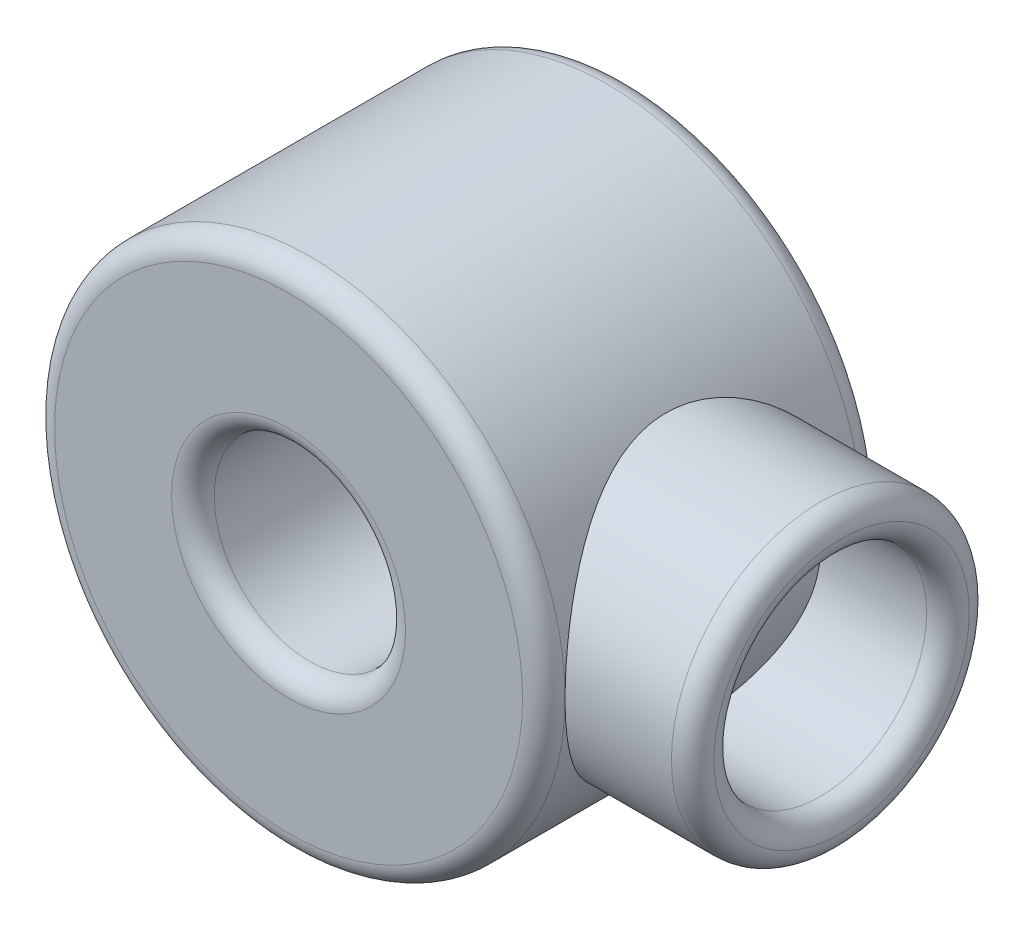
ISO-10303-21;
HEADER;
FILE_DESCRIPTION(('STEP AP214'),'2;1');
FILE_NAME('part.step','',(''),(''),'','','');
FILE_SCHEMA(('AUTOMOTIVE_DESIGN { 1 0 10303 214 1 1 1 1 }'));
ENDSEC;
DATA;
#1=APPLICATION_CONTEXT('core data for automotive mechanical design processes');
#2=APPLICATION_PROTOCOL_DEFINITION('international standard','automotive_design',2000,#1);
#3=PRODUCT_CONTEXT('',#1,'mechanical');
#4=PRODUCT('Part','Part','',(#3));
#5=PRODUCT_RELATED_PRODUCT_CATEGORY('part','',(#4));
#6=PRODUCT_DEFINITION_FORMATION('','',#4);
#7=PRODUCT_DEFINITION_CONTEXT('part definition',#1,'design');
#8=PRODUCT_DEFINITION('design','',#6,#7);
#9=PRODUCT_DEFINITION_SHAPE('','',#8);
#10=(LENGTH_UNIT() NAMED_UNIT(*) SI_UNIT(.MILLI.,.METRE.));
#11=(NAMED_UNIT(*) PLANE_ANGLE_UNIT() SI_UNIT($,.RADIAN.));
#12=(NAMED_UNIT(*) SI_UNIT($,.STERADIAN.) SOLID_ANGLE_UNIT());
#13=UNCERTAINTY_MEASURE_WITH_UNIT(LENGTH_MEASURE(1.E-05),#10,'distance_accuracy_value','');
#14=(GEOMETRIC_REPRESENTATION_CONTEXT(3) GLOBAL_UNCERTAINTY_ASSIGNED_CONTEXT((#13)) GLOBAL_UNIT_ASSIGNED_CONTEXT((#10,
#11,#12)) REPRESENTATION_CONTEXT('',''));
#15=CARTESIAN_POINT('',(0.,0.,0.));
#16=DIRECTION('',(0.,0.,1.));
#17=DIRECTION('',(1.,0.,0.));
#18=AXIS2_PLACEMENT_3D('',#15,#16,#17);
#19=CARTESIAN_POINT('',(0.,0.,25.4));
#20=DIRECTION('',(0.,0.,1.));
#21=DIRECTION('',(1.,0.,0.));
#22=AXIS2_PLACEMENT_3D('',#19,#20,#21);
#23=PLANE('',#22);
#24=CARTESIAN_POINT('',(0.,0.,25.4));
#25=DIRECTION('',(0.,0.,1.));
#26=DIRECTION('',(1.,0.,0.));
#27=AXIS2_PLACEMENT_3D('',#24,#25,#26);
#28=CIRCLE('',#27,17.4625);
#29=CARTESIAN_POINT('',(17.4625,0.,25.4));
#30=VERTEX_POINT('',#29);
#31=EDGE_CURVE('E11',#30,#30,#28,.F.);
#32=ORIENTED_EDGE('',*,*,#31,.T.);
#33=EDGE_LOOP('',(#32));
#34=FACE_BOUND('',#33,.T.);
#35=CARTESIAN_POINT('',(0.,0.,25.4));
#36=DIRECTION('',(0.,0.,1.));
#37=DIRECTION('',(1.,0.,0.));
#38=AXIS2_PLACEMENT_3D('',#35,#36,#37);
#39=CIRCLE('',#38,34.925);
#40=CARTESIAN_POINT('',(34.925,0.,25.4));
#41=VERTEX_POINT('',#40);
#42=EDGE_CURVE('E42',#41,#41,#39,.T.);
#43=ORIENTED_EDGE('',*,*,#42,.T.);
#44=EDGE_LOOP('',(#43));
#45=FACE_BOUND('',#44,.T.);
#46=ADVANCED_FACE('F33',(#34,#45),#23,.T.);
#47=CARTESIAN_POINT('',(0.,0.,-25.4));
#48=DIRECTION('',(0.,0.,1.));
#49=DIRECTION('',(1.,0.,0.));
#50=AXIS2_PLACEMENT_3D('',#47,#48,#49);
#51=PLANE('',#50);
#52=CARTESIAN_POINT('',(0.,0.,-25.4));
#53=DIRECTION('',(0.,0.,1.));
#54=DIRECTION('',(1.,0.,0.));
#55=AXIS2_PLACEMENT_3D('',#52,#53,#54);
#56=CIRCLE('',#55,17.4625);
#57=CARTESIAN_POINT('',(17.4625,0.,-25.4));
#58=VERTEX_POINT('',#57);
#59=EDGE_CURVE('E131',#58,#58,#56,.T.);
#60=ORIENTED_EDGE('',*,*,#59,.T.);
#61=EDGE_LOOP('',(#60));
#62=FACE_BOUND('',#61,.T.);
#63=CARTESIAN_POINT('',(0.,0.,-25.4));
#64=DIRECTION('',(0.,0.,1.));
#65=DIRECTION('',(1.,0.,0.));
#66=AXIS2_PLACEMENT_3D('',#63,#64,#65);
#67=CIRCLE('',#66,34.925);
#68=CARTESIAN_POINT('',(34.925,0.,-25.4));
#69=VERTEX_POINT('',#68);
#70=EDGE_CURVE('E111',#69,#69,#67,.F.);
#71=ORIENTED_EDGE('',*,*,#70,.T.);
#72=EDGE_LOOP('',(#71));
#73=FACE_BOUND('',#72,.T.);
#74=ADVANCED_FACE('F79',(#62,#73),#51,.F.);
#75=CARTESIAN_POINT('',(0.,0.,25.4));
#76=DIRECTION('',(0.,0.,-1.));
#77=DIRECTION('',(-1.,0.,0.));
#78=AXIS2_PLACEMENT_3D('',#75,#76,#77);
#79=CYLINDRICAL_SURFACE('',#78,38.1);
#80=CARTESIAN_POINT('',(38.1,0.,-22.225));
#81=CARTESIAN_POINT('',(38.0999963509971,-0.571259580394237,-22.2249960030538));
#82=CARTESIAN_POINT('',(38.0871175963954,-1.14273821712484,-22.2029381302069));
#83=CARTESIAN_POINT('',(38.035908529454,-2.28142502079208,-22.1149770566929));
#84=CARTESIAN_POINT('',(37.9975608317495,-2.84863000282872,-22.0490439062461));
#85=CARTESIAN_POINT('',(37.8962489374581,-3.97556521846198,-21.8739894738922));
#86=CARTESIAN_POINT('',(37.8332239368348,-4.53527342994698,-21.7647615067743));
#87=CARTESIAN_POINT('',(37.6841302862849,-5.64162251749112,-21.5045496602023));
#88=CARTESIAN_POINT('',(37.5980653803842,-6.18826550096584,-21.3535725649251));
#89=CARTESIAN_POINT('',(37.405401931645,-7.26238125337551,-21.0124823544328));
#90=CARTESIAN_POINT('',(37.298907015363,-7.7899354411171,-20.8225664267161));
#91=CARTESIAN_POINT('',(37.067478590857,-8.8257406471969,-20.4051161195023));
#92=CARTESIAN_POINT('',(36.9425444006272,-9.33399095067579,-20.1775803485382));
#93=CARTESIAN_POINT('',(36.6769427153431,-10.3284381187411,-19.6870829906519));
#94=CARTESIAN_POINT('',(36.5362833069931,-10.8146461394191,-19.4241395980255));
#95=CARTESIAN_POINT('',(36.2419863006271,-11.7632960372978,-18.8647494832277));
#96=CARTESIAN_POINT('',(36.0883474126675,-12.2257355449423,-18.5682994300622));
#97=CARTESIAN_POINT('',(35.7593028832951,-13.1584404285333,-17.9207092271753));
#98=CARTESIAN_POINT('',(35.5831278445966,-13.6267516094672,-17.5671451941634));
#99=CARTESIAN_POINT('',(35.2230230466798,-14.5322433293773,-16.8257829166989));
#100=CARTESIAN_POINT('',(35.0390929544518,-14.969422529343,-16.4379832013482));
#101=CARTESIAN_POINT('',(34.6672125020736,-15.8115940210529,-15.6296253871527));
#102=CARTESIAN_POINT('',(34.479257695211,-16.2165481039377,-15.2090295381623));
#103=CARTESIAN_POINT('',(34.1036698392169,-16.9922165646355,-14.3372130180603));
#104=CARTESIAN_POINT('',(33.9160368072981,-17.3629291635851,-13.8859907580005));
#105=CARTESIAN_POINT('',(33.5242014038039,-18.1089800601577,-12.9011447855479));
#106=CARTESIAN_POINT('',(33.3205624566128,-18.4799857437863,-12.3640022969293));
#107=CARTESIAN_POINT('',(32.9254374089288,-19.1751268155827,-11.255798679019));
#108=CARTESIAN_POINT('',(32.7339531506789,-19.4992551081836,-10.6847324332956));
#109=CARTESIAN_POINT('',(32.370162283703,-20.0973881029849,-9.51200857010477));
#110=CARTESIAN_POINT('',(32.1978314912587,-20.371456300585,-8.91039095956709));
#111=CARTESIAN_POINT('',(31.8790978677655,-20.8667192635803,-7.67922556321244));
#112=CARTESIAN_POINT('',(31.7326860546459,-21.0879323549334,-7.0496875479974));
#113=CARTESIAN_POINT('',(31.5024789565557,-21.429790900854,-5.91446716784314));
#114=CARTESIAN_POINT('',(31.4120256555915,-21.5618650749021,-5.41355115993086));
#115=CARTESIAN_POINT('',(31.2533583219728,-21.7912161412235,-4.40035983957836));
#116=CARTESIAN_POINT('',(31.1851409547714,-21.8884982511999,-3.88808624266293));
#117=CARTESIAN_POINT('',(31.0733342239738,-22.0469346970801,-2.85581707247093));
#118=CARTESIAN_POINT('',(31.0297209273132,-22.1081241439723,-2.33582950997836));
#119=CARTESIAN_POINT('',(30.9686127216231,-22.1936435955908,-1.29127334892129));
#120=CARTESIAN_POINT('',(30.9511183079596,-22.2179729012343,-0.766704663661824));
#121=CARTESIAN_POINT('',(30.9429089625341,-22.2294048420672,0.283887473427907));
#122=CARTESIAN_POINT('',(30.9522367649853,-22.2164480715835,0.809911911286579));
#123=CARTESIAN_POINT('',(30.9974064129885,-22.1533807561875,1.85856889145238));
#124=CARTESIAN_POINT('',(31.0332483745415,-22.1032700487246,2.38120141890961));
#125=CARTESIAN_POINT('',(31.1301400919828,-21.9665964624782,3.4196059236326));
#126=CARTESIAN_POINT('',(31.1912051875179,-21.8800114008929,3.93537352857377));
#127=CARTESIAN_POINT('',(31.3363966723235,-21.6715558003377,4.95639200584963));
#128=CARTESIAN_POINT('',(31.4205236076554,-21.5496844258497,5.46164262885696));
#129=CARTESIAN_POINT('',(31.6083845410838,-21.273168585001,6.45497498359692));
#130=CARTESIAN_POINT('',(31.7119622522534,-21.1187842353763,6.94315910516598));
#131=CARTESIAN_POINT('',(31.9361976209831,-20.778133846418,7.90442505243732));
#132=CARTESIAN_POINT('',(32.0568621658694,-20.5918549447302,8.37750069354619));
#133=CARTESIAN_POINT('',(32.3121203767104,-20.1889504229026,9.30662816731224));
#134=CARTESIAN_POINT('',(32.446714114056,-19.9723246472247,9.76267991270092));
#135=CARTESIAN_POINT('',(32.7267278848488,-19.5101076235824,10.6564298130507));
#136=CARTESIAN_POINT('',(32.8721491786955,-19.2645130015016,11.0941258219823));
#137=CARTESIAN_POINT('',(33.1956467743864,-18.7024306011436,12.0212506265805));
#138=CARTESIAN_POINT('',(33.3751299096625,-18.3809467338164,12.5071660508183));
#139=CARTESIAN_POINT('',(33.7401128201598,-17.702071340072,13.4508444023949));
#140=CARTESIAN_POINT('',(33.9256131022341,-17.3446767833791,13.9086049486586));
#141=CARTESIAN_POINT('',(34.298436295566,-16.5952566851086,14.7947644761149));
#142=CARTESIAN_POINT('',(34.4857605748469,-16.2032030268367,15.2231391087593));
#143=CARTESIAN_POINT('',(34.8579494219612,-15.3861920905913,16.0484552880398));
#144=CARTESIAN_POINT('',(35.0428138659389,-14.9612331630914,16.44539525685));
#145=CARTESIAN_POINT('',(35.42871098658,-14.0251027401433,17.253270117062));
#146=CARTESIAN_POINT('',(35.6288989412861,-13.509779664642,17.6598168146908));
#147=CARTESIAN_POINT('',(36.0157751854091,-12.4417264434862,18.4278795750606));
#148=CARTESIAN_POINT('',(36.2024621668965,-11.8889926836236,18.7893912774057));
#149=CARTESIAN_POINT('',(36.5570778818888,-10.7492345461658,19.4638852894803));
#150=CARTESIAN_POINT('',(36.7250146329158,-10.1622249895546,19.7768883636914));
#151=CARTESIAN_POINT('',(37.0373218956199,-8.95733854876831,20.3509671751044));
#152=CARTESIAN_POINT('',(37.1816953469984,-8.33946552762698,20.612049390719));
#153=CARTESIAN_POINT('',(37.4336962413995,-7.11968050822315,21.0631150842118));
#154=CARTESIAN_POINT('',(37.5431374966494,-6.51947245419077,21.2566900177523));
#155=CARTESIAN_POINT('',(37.7345162334651,-5.30063113668877,21.5929033421447));
#156=CARTESIAN_POINT('',(37.8164546399084,-4.68199849357094,21.7355434458652));
#157=CARTESIAN_POINT('',(37.950293406555,-3.43217988716463,21.96757554501));
#158=CARTESIAN_POINT('',(38.0022205185722,-2.80100562420306,22.0570149651567));
#159=CARTESIAN_POINT('',(38.074510963817,-1.53153716283145,22.1813346088663));
#160=CARTESIAN_POINT('',(38.0948781856602,-0.89324385134965,22.2162215540545));
#161=CARTESIAN_POINT('',(38.1028763174196,0.302681734757406,22.2299291938814));
#162=CARTESIAN_POINT('',(38.0943485245782,0.860226469211622,22.2153286563949));
#163=CARTESIAN_POINT('',(38.0530097915356,1.97170246636328,22.1443678993608));
#164=CARTESIAN_POINT('',(38.0202013428489,2.52563409393003,22.0880119644653));
#165=CARTESIAN_POINT('',(37.9310957697101,3.62582646388673,21.9342782194241));
#166=CARTESIAN_POINT('',(37.8747989881531,4.17208731813842,21.8369010081287));
#167=CARTESIAN_POINT('',(37.7400410718621,5.25319584474537,21.6023270846997));
#168=CARTESIAN_POINT('',(37.6615793099747,5.78804319369737,21.4651292458471));
#169=CARTESIAN_POINT('',(37.4856764674471,6.83455635786095,21.1549664315148));
#170=CARTESIAN_POINT('',(37.3885564467066,7.34645538703542,20.9826038159389));
#171=CARTESIAN_POINT('',(37.1766016910815,8.35313670593619,20.6025534894451));
#172=CARTESIAN_POINT('',(37.061767380163,8.84791940497032,20.3948666239501));
#173=CARTESIAN_POINT('',(36.8166451823709,9.81809670325887,19.9459606195017));
#174=CARTESIAN_POINT('',(36.6863555875015,10.2934891518403,19.7047377739096));
#175=CARTESIAN_POINT('',(36.4127870301701,11.2229080504738,19.1905980832089));
#176=CARTESIAN_POINT('',(36.2695072710824,11.6769331875719,18.9176792940484));
#177=CARTESIAN_POINT('',(35.9570518061169,12.6081759736369,18.3118654750928));
#178=CARTESIAN_POINT('',(35.7867337952843,13.0828739439622,17.9756838869043));
#179=CARTESIAN_POINT('',(35.4370384196276,14.002440739189,17.2690068979843));
#180=CARTESIAN_POINT('',(35.2576605200584,14.4473077997545,16.8985094707383));
#181=CARTESIAN_POINT('',(34.8934197935651,15.3061110133039,16.1247636758645));
#182=CARTESIAN_POINT('',(34.7085512883247,15.7200134682856,15.7214805960987));
#183=CARTESIAN_POINT('',(34.3374441472227,16.5149134638372,14.8842702635751));
#184=CARTESIAN_POINT('',(34.1512054470603,16.8959094493423,14.450341564353));
#185=CARTESIAN_POINT('',(33.7593400647145,17.667079154761,13.4997405499044));
#186=CARTESIAN_POINT('',(33.5540596471306,18.0528971896109,12.9793799871476));
#187=CARTESIAN_POINT('',(33.1530295200067,18.7792118307009,11.9043143752743));
#188=CARTESIAN_POINT('',(32.9572812573019,19.1197015703153,11.3496041412511));
#189=CARTESIAN_POINT('',(32.5820285486205,19.75238186023,10.2087731216042));
#190=CARTESIAN_POINT('',(32.4025082290422,20.0446198451858,9.62268394345161));
#191=CARTESIAN_POINT('',(32.0663284058648,20.5781459751132,8.42152280782377));
#192=CARTESIAN_POINT('',(31.9096618488709,20.819449850285,7.80645987042838));
#193=CARTESIAN_POINT('',(31.6565686308223,21.2017044931366,6.68648559582191));
#194=CARTESIAN_POINT('',(31.5544359130704,21.3530751397831,6.18640041009228));
#195=CARTESIAN_POINT('',(31.3715260375939,21.6209089968181,5.17314128223252));
#196=CARTESIAN_POINT('',(31.2907459263686,21.737377035247,4.65996916107059));
#197=CARTESIAN_POINT('',(31.1533289262326,21.9338665435509,3.62405067442941));
#198=CARTESIAN_POINT('',(31.0966664646384,22.013926624096,3.10131506611469));
#199=CARTESIAN_POINT('',(31.0094210543186,22.1366554011802,2.04927779577936));
#200=CARTESIAN_POINT('',(30.9788384096995,22.1793236617081,1.51997605726668));
#201=CARTESIAN_POINT('',(30.9448834544424,22.2266744759586,0.457353302977234));
#202=CARTESIAN_POINT('',(30.9415851156581,22.2312537649395,-0.0759747181005243));
#203=CARTESIAN_POINT('',(30.9625230457334,22.2020827387058,-1.14103274034611));
#204=CARTESIAN_POINT('',(30.9867594075809,22.1683322940473,-1.67276273611114));
#205=CARTESIAN_POINT('',(31.0618428621052,22.063002258996,-2.73082032385259));
#206=CARTESIAN_POINT('',(31.1127039235291,21.9914028107896,-3.25714493193415));
#207=CARTESIAN_POINT('',(31.239153969159,21.8114032337626,-4.30041304831599));
#208=CARTESIAN_POINT('',(31.3147432658021,21.7030026399648,-4.81735643799899));
#209=CARTESIAN_POINT('',(31.4854554908764,21.4545582328418,-5.82349319817842));
#210=CARTESIAN_POINT('',(31.579930449022,21.315551657018,-6.31305461160793));
#211=CARTESIAN_POINT('',(31.7869406071021,21.0055973416354,-7.27822374981012));
#212=CARTESIAN_POINT('',(31.8994830338122,20.8346368163578,-7.75382580058287));
#213=CARTESIAN_POINT('',(32.1396018540553,20.4622832470601,-8.68901134133973));
#214=CARTESIAN_POINT('',(32.2671782847885,20.2608901277373,-9.14859479168372));
#215=CARTESIAN_POINT('',(32.5343317689044,19.8290624135851,-10.0503167724235));
#216=CARTESIAN_POINT('',(32.6739102666754,19.5986243217809,-10.4924531937901));
#217=CARTESIAN_POINT('',(32.9844055650418,19.0721331382117,-11.4251412444589));
#218=CARTESIAN_POINT('',(33.1568271534772,18.7714456438366,-11.9125802872677));
#219=CARTESIAN_POINT('',(33.5092568678238,18.1348308043058,-12.86097938312));
#220=CARTESIAN_POINT('',(33.6892655794511,17.7989007354761,-13.3219373853458));
#221=CARTESIAN_POINT('',(34.05279482927,17.0931220150862,-14.216204318434));
#222=CARTESIAN_POINT('',(34.2363177015741,16.723250153935,-14.6494939809696));
#223=CARTESIAN_POINT('',(34.6027679533806,15.9512090794858,-15.4865677027864));
#224=CARTESIAN_POINT('',(34.7856952995066,15.5490380873352,-15.8903501346349));
#225=CARTESIAN_POINT('',(35.1725289327467,14.6551158973896,-16.7212731823079));
#226=CARTESIAN_POINT('',(35.375775973025,14.1587143737193,-17.1437374273499));
#227=CARTESIAN_POINT('',(35.7711403507302,13.1278445450123,-17.9453805777603));
#228=CARTESIAN_POINT('',(35.9632564195649,12.5933719164423,-18.3245545541152));
#229=CARTESIAN_POINT('',(36.33122565375,11.4887347555171,-19.0365835209081));
#230=CARTESIAN_POINT('',(36.5070723690456,10.9185562163448,-19.3694201668845));
#231=CARTESIAN_POINT('',(36.8374404496631,9.74596505642455,-19.9851229076953));
#232=CARTESIAN_POINT('',(36.9919649898873,9.1435572532378,-20.2679964438685));
#233=CARTESIAN_POINT('',(37.2683972099224,7.93975341078119,-20.7681339530426));
#234=CARTESIAN_POINT('',(37.391503522412,7.33966217128809,-20.9878717804121));
#235=CARTESIAN_POINT('',(37.6106909898554,6.11807977515916,-21.3759297684079));
#236=CARTESIAN_POINT('',(37.7067674009323,5.4965848835362,-21.5442409038495));
#237=CARTESIAN_POINT('',(37.8686498158244,4.23975512059755,-21.8263273148736));
#238=CARTESIAN_POINT('',(37.9345584498199,3.6044749912871,-21.940287547532));
#239=CARTESIAN_POINT('',(38.0344460193264,2.32429899641979,-22.1125459586785));
#240=CARTESIAN_POINT('',(38.0684534931071,1.67941225054912,-22.1708938877988));
#241=CARTESIAN_POINT('',(38.0906590121129,0.861065366626678,-22.208983051107));
#242=CARTESIAN_POINT('',(38.0941601531496,0.688933059460266,-22.2149875117689));
#243=CARTESIAN_POINT('',(38.0988312072769,0.344540476656352,-22.2229966059884));
#244=CARTESIAN_POINT('',(38.1000011004646,0.172280199938876,-22.2250012053972));
#245=CARTESIAN_POINT('',(38.1,0.,-22.225));
#246=B_SPLINE_CURVE_WITH_KNOTS('',3,(#80,#81,#82,#83,#84,#85,#86,#87,#88,#89,#90,#91,#92,#93,
#94,#95,#96,#97,#98,#99,#100,#101,#102,#103,#104,#105,#106,#107,#108,#109,#110,#111,#112,#113,
#114,#115,#116,#117,#118,#119,#120,#121,#122,#123,#124,#125,#126,#127,#128,#129,#130,#131,#132,
#133,#134,#135,#136,#137,#138,#139,#140,#141,#142,#143,#144,#145,#146,#147,#148,#149,#150,#151,
#152,#153,#154,#155,#156,#157,#158,#159,#160,#161,#162,#163,#164,#165,#166,#167,#168,#169,#170,
#171,#172,#173,#174,#175,#176,#177,#178,#179,#180,#181,#182,#183,#184,#185,#186,#187,#188,#189,
#190,#191,#192,#193,#194,#195,#196,#197,#198,#199,#200,#201,#202,#203,#204,#205,#206,#207,#208,
#209,#210,#211,#212,#213,#214,#215,#216,#217,#218,#219,#220,#221,#222,#223,#224,#225,#226,#227,
#228,#229,#230,#231,#232,#233,#234,#235,#236,#237,#238,#239,#240,#241,#242,#243,#244,#245),
.UNSPECIFIED.,.T.,.F.,(4,2,2,2,2,2,2,2,2,2,2,2,2,2,2,2,2,2,2,2,2,2,2,2,2,2,2,2,2,2,2,2,2,2,2,2,
2,2,2,2,2,2,2,2,2,2,2,2,2,2,2,2,2,2,2,2,2,2,2,2,2,2,2,2,2,2,2,2,2,2,2,2,2,2,2,2,2,2,2,2,2,2,4),
(0.,1.71359209103401,3.42835510167532,5.14737009086634,6.86610590643065,8.57634392567924,
10.2866452166475,11.9960709949419,13.7056668619148,15.5418007563623,17.3780135766943,
19.2163720966339,21.0548260666246,23.1038316045362,25.1531469650172,27.1998446788015,
29.2458317270581,30.8218523521052,32.3976365249708,33.9718852339858,35.5461637995394,
37.1229519568715,38.6997470127834,40.2775024241767,41.8552951971067,43.4209144610885,
44.987166597583,46.5534267619517,48.1198695353317,49.9470077352251,51.7743002454299,
53.6030889670595,55.4319694244805,57.4880683750015,59.5443662474607,61.5997814604361,
63.6549400483344,65.572412212577,67.4898198887873,69.4055157573842,71.3209755669413,
72.9923177214013,74.6634883979529,76.334634678715,78.0058282489323,79.6504924288214,
81.2951172521488,82.939923996018,84.5848316764697,86.4012928709571,88.2178614046493,
90.0363789426147,91.8549823715079,93.8911687426156,95.9276632183718,97.962143609753,
99.9959947615076,101.591549090077,103.186882605339,104.780520299888,106.374176576969,
107.972152084412,109.570132988412,111.168953120515,112.76779345423,114.319072047895,
115.870972687928,117.42287716807,118.974968674187,120.767540072066,122.56025010856,
124.354195277282,126.148239314145,128.194096094126,130.240185582765,132.2870828072,
134.333674916062,136.283284406211,138.233235848993,140.176503369502,142.118030811341,
142.634810709319,143.15159501927),.UNSPECIFIED.);
#247=CARTESIAN_POINT('',(38.1,0.,22.225));
#248=VERTEX_POINT('',#247);
#249=CARTESIAN_POINT('',(38.1,0.,-22.225));
#250=VERTEX_POINT('',#249);
#251=EDGE_CURVE('E110',#248,#250,#246,.T.);
#252=ORIENTED_EDGE('',*,*,#251,.T.);
#253=CARTESIAN_POINT('',(0.,0.,-22.225));
#254=DIRECTION('',(0.,0.,1.));
#255=DIRECTION('',(1.,0.,0.));
#256=AXIS2_PLACEMENT_3D('',#253,#254,#255);
#257=CIRCLE('',#256,38.1);
#258=EDGE_CURVE('E51',#250,#250,#257,.T.);
#259=ORIENTED_EDGE('',*,*,#258,.T.);
#260=EDGE_CURVE('E106',#250,#248,#246,.T.);
#261=ORIENTED_EDGE('',*,*,#260,.T.);
#262=CARTESIAN_POINT('',(0.,0.,22.225));
#263=DIRECTION('',(0.,0.,1.));
#264=DIRECTION('',(1.,0.,0.));
#265=AXIS2_PLACEMENT_3D('',#262,#263,#264);
#266=CIRCLE('',#265,38.1);
#267=EDGE_CURVE('E47',#248,#248,#266,.F.);
#268=ORIENTED_EDGE('',*,*,#267,.T.);
#269=EDGE_LOOP('',(#252,#259,#261,#268));
#270=FACE_BOUND('',#269,.T.);
#271=ADVANCED_FACE('F86',(#270),#79,.T.);
#272=CARTESIAN_POINT('',(0.,0.,25.4));
#273=DIRECTION('',(0.,0.,-1.));
#274=DIRECTION('',(-1.,0.,0.));
#275=AXIS2_PLACEMENT_3D('',#272,#273,#274);
#276=CYLINDRICAL_SURFACE('',#275,14.2875);
#277=CARTESIAN_POINT('',(0.,0.,-22.225));
#278=DIRECTION('',(0.,0.,1.));
#279=DIRECTION('',(1.,0.,0.));
#280=AXIS2_PLACEMENT_3D('',#277,#278,#279);
#281=CIRCLE('',#280,14.2875);
#282=CARTESIAN_POINT('',(14.2875,0.,-22.225));
#283=VERTEX_POINT('',#282);
#284=EDGE_CURVE('E61',#283,#283,#281,.F.);
#285=ORIENTED_EDGE('',*,*,#284,.T.);
#286=EDGE_LOOP('',(#285));
#287=FACE_BOUND('',#286,.T.);
#288=CARTESIAN_POINT('',(0.,0.,22.225));
#289=DIRECTION('',(0.,0.,1.));
#290=DIRECTION('',(1.,0.,0.));
#291=AXIS2_PLACEMENT_3D('',#288,#289,#290);
#292=CIRCLE('',#291,14.2875);
#293=CARTESIAN_POINT('',(14.2875,0.,22.225));
#294=VERTEX_POINT('',#293);
#295=EDGE_CURVE('E135',#294,#294,#292,.T.);
#296=ORIENTED_EDGE('',*,*,#295,.T.);
#297=EDGE_LOOP('',(#296));
#298=FACE_BOUND('',#297,.T.);
#299=ADVANCED_FACE('F90',(#287,#298),#276,.F.);
#300=CARTESIAN_POINT('',(29.21,0.,0.));
#301=DIRECTION('',(1.,0.,0.));
#302=DIRECTION('',(0.,0.,-1.));
#303=AXIS2_PLACEMENT_3D('',#300,#301,#302);
#304=CYLINDRICAL_SURFACE('',#303,22.225);
#305=CARTESIAN_POINT('',(53.975,0.,0.));
#306=DIRECTION('',(1.,0.,0.));
#307=DIRECTION('',(0.,0.,-1.));
#308=AXIS2_PLACEMENT_3D('',#305,#306,#307);
#309=CIRCLE('',#308,22.225);
#310=CARTESIAN_POINT('',(53.975,0.,-22.225));
#311=VERTEX_POINT('',#310);
#312=EDGE_CURVE('E59',#311,#311,#309,.F.);
#313=ORIENTED_EDGE('',*,*,#312,.T.);
#314=EDGE_LOOP('',(#313));
#315=FACE_BOUND('',#314,.T.);
#316=ORIENTED_EDGE('',*,*,#260,.F.);
#317=ORIENTED_EDGE('',*,*,#251,.F.);
#318=EDGE_LOOP('',(#316,#317));
#319=FACE_BOUND('',#318,.T.);
#320=ADVANCED_FACE('F113',(#315,#319),#304,.T.);
#321=CARTESIAN_POINT('',(29.21,0.,0.));
#322=DIRECTION('',(1.,0.,0.));
#323=DIRECTION('',(0.,0.,-1.));
#324=AXIS2_PLACEMENT_3D('',#321,#322,#323);
#325=CYLINDRICAL_SURFACE('',#324,15.875);
#326=CARTESIAN_POINT('',(53.975,0.,0.));
#327=DIRECTION('',(1.,0.,0.));
#328=DIRECTION('',(0.,0.,-1.));
#329=AXIS2_PLACEMENT_3D('',#326,#327,#328);
#330=CIRCLE('',#329,15.875);
#331=CARTESIAN_POINT('',(53.975,0.,-15.875));
#332=VERTEX_POINT('',#331);
#333=EDGE_CURVE('E56',#332,#332,#330,.T.);
#334=ORIENTED_EDGE('',*,*,#333,.T.);
#335=EDGE_LOOP('',(#334));
#336=FACE_BOUND('',#335,.T.);
#337=CARTESIAN_POINT('',(38.1,0.,-15.875));
#338=CARTESIAN_POINT('',(38.0999976966944,-0.425358553554698,-15.8749971265875));
#339=CARTESIAN_POINT('',(38.0928572987754,-0.850860925466148,-15.8578810949085));
#340=CARTESIAN_POINT('',(38.0644735672434,-1.69883622857061,-15.789576063656));
#341=CARTESIAN_POINT('',(38.0432213094014,-2.12130707165081,-15.7383655029169));
#342=CARTESIAN_POINT('',(37.9871095794311,-2.96089577354418,-15.6022425812766));
#343=CARTESIAN_POINT('',(37.9522184021993,-3.3779988036245,-15.517251686653));
#344=CARTESIAN_POINT('',(37.8697560021386,-4.20277935045326,-15.3144576817155));
#345=CARTESIAN_POINT('',(37.822186737465,-4.61045831220919,-15.1966596384038));
#346=CARTESIAN_POINT('',(37.7157691785296,-5.41237650559872,-14.9298284444753));
#347=CARTESIAN_POINT('',(37.6569595207208,-5.80665647829241,-14.7809021311338));
#348=CARTESIAN_POINT('',(37.529416556731,-6.58079089163118,-14.4528736711575));
#349=CARTESIAN_POINT('',(37.4606828969794,-6.96064481769833,-14.2737704493471));
#350=CARTESIAN_POINT('',(37.3149956022831,-7.70352597591549,-13.8869219246886));
#351=CARTESIAN_POINT('',(37.2380467304326,-8.0665627852425,-13.679193198513));
#352=CARTESIAN_POINT('',(37.0776788685196,-8.77424861864968,-13.2364076919903));
#353=CARTESIAN_POINT('',(36.9942573557469,-9.11889038403535,-13.0013402383905));
#354=CARTESIAN_POINT('',(36.8189854555007,-9.80319815298264,-12.4940990977063));
#355=CARTESIAN_POINT('',(36.7269241062825,-10.1419175644372,-12.2207208407296));
#356=CARTESIAN_POINT('',(36.5401836560309,-10.7953917219649,-11.6474919085924));
#357=CARTESIAN_POINT('',(36.4455044572957,-11.1101455719581,-11.3476402444873));
#358=CARTESIAN_POINT('',(36.255891165387,-11.7141194667116,-10.723051305389));
#359=CARTESIAN_POINT('',(36.1609569811175,-12.0033286223518,-10.3983035268825));
#360=CARTESIAN_POINT('',(35.9733240232701,-12.5544706273761,-9.72573672394704));
#361=CARTESIAN_POINT('',(35.8806256139708,-12.8163990546306,-9.37791397404156));
#362=CARTESIAN_POINT('',(35.6955029077459,-13.323570293322,-8.643322521729));
#363=CARTESIAN_POINT('',(35.6033190843813,-13.5673464105777,-8.25547835704184));
#364=CARTESIAN_POINT('',(35.4270954734548,-14.0210607153199,-7.45891925467872));
#365=CARTESIAN_POINT('',(35.3430523206887,-14.2310129090067,-7.05021304859988));
#366=CARTESIAN_POINT('',(35.1858680533619,-14.6153281217112,-6.21444334168801));
#367=CARTESIAN_POINT('',(35.1127250163186,-14.7896974185885,-5.78738309516596));
#368=CARTESIAN_POINT('',(34.9799217237211,-15.1011184448777,-4.91783185004635));
#369=CARTESIAN_POINT('',(34.9202604643016,-15.2381729529383,-4.47534200318479));
#370=CARTESIAN_POINT('',(34.819162460377,-15.4677373488708,-3.5999332179845));
#371=CARTESIAN_POINT('',(34.7769867701261,-15.5620736954423,-3.16757867131512));
#372=CARTESIAN_POINT('',(34.7084091251475,-15.714431181108,-2.29527248070995));
#373=CARTESIAN_POINT('',(34.6820066828706,-15.7724534426693,-1.85532107202489));
#374=CARTESIAN_POINT('',(34.6459756439899,-15.8514436365541,-0.971626674900934));
#375=CARTESIAN_POINT('',(34.636339103381,-15.8724291176812,-0.527885582299841));
#376=CARTESIAN_POINT('',(34.634186697996,-15.8771260800995,0.359823849967238));
#377=CARTESIAN_POINT('',(34.6416699320155,-15.8608395234334,0.803792176441365));
#378=CARTESIAN_POINT('',(34.6722401118987,-15.793889862773,1.65420692485195));
#379=CARTESIAN_POINT('',(34.6940849478707,-15.7459620743405,2.06091711674361));
#380=CARTESIAN_POINT('',(34.7514062821955,-15.6190462601531,2.86845933253753));
#381=CARTESIAN_POINT('',(34.7868819744582,-15.5400600710971,3.2692917025825));
#382=CARTESIAN_POINT('',(34.8703682365208,-15.3518076781774,4.06248891123971));
#383=CARTESIAN_POINT('',(34.9183805456648,-15.2425372725188,4.45485256670862));
#384=CARTESIAN_POINT('',(35.0255110325567,-14.9947250191998,5.22866276106179));
#385=CARTESIAN_POINT('',(35.0846296449754,-14.8561820258626,5.61010887198913));
#386=CARTESIAN_POINT('',(35.2136503971056,-14.5477604731402,6.36781825568758));
#387=CARTESIAN_POINT('',(35.2837532094857,-14.3772840730813,6.74380372992009));
#388=CARTESIAN_POINT('',(35.4318847174752,-14.0082501404171,7.48025853962812));
#389=CARTESIAN_POINT('',(35.509916296048,-13.8096823831987,7.84072216291489));
#390=CARTESIAN_POINT('',(35.6718558647358,-13.3858193045347,8.54424619092255));
#391=CARTESIAN_POINT('',(35.7557646392396,-13.1605204126738,8.88730426206845));
#392=CARTESIAN_POINT('',(35.927372453583,-12.6845537125593,9.5543508551767));
#393=CARTESIAN_POINT('',(36.0150717059228,-12.4338844809447,9.8783383055988));
#394=CARTESIAN_POINT('',(36.1996954449746,-11.8862296981023,10.5323389983229));
#395=CARTESIAN_POINT('',(36.2967715165206,-11.5871190509107,10.860532847679));
#396=CARTESIAN_POINT('',(36.4902781919388,-10.96250167238,11.4906887130599));
#397=CARTESIAN_POINT('',(36.5867090320168,-10.6370052454329,11.792660874878));
#398=CARTESIAN_POINT('',(36.776484284945,-9.9610982210843,12.3688919240237));
#399=CARTESIAN_POINT('',(36.869826612021,-9.61067127086928,12.6431323302087));
#400=CARTESIAN_POINT('',(37.0508647788621,-8.88720385931836,13.1617337943029));
#401=CARTESIAN_POINT('',(37.1385629038795,-8.51417267039266,13.406106981489));
#402=CARTESIAN_POINT('',(37.3079887209376,-7.73855121077267,13.8686354444781));
#403=CARTESIAN_POINT('',(37.3895287853771,-7.33547363530486,14.0860437878621));
#404=CARTESIAN_POINT('',(37.5419910674504,-6.51036807058015,14.4858859239206));
#405=CARTESIAN_POINT('',(37.6129130130825,-6.08833959622284,14.6683188206718));
#406=CARTESIAN_POINT('',(37.7420395857655,-5.22851150670424,14.9963298569659));
#407=CARTESIAN_POINT('',(37.8002498840866,-4.79071902658862,15.1419244364526));
#408=CARTESIAN_POINT('',(37.9022393806395,-3.9025610871121,15.3947646583311));
#409=CARTESIAN_POINT('',(37.9460196750112,-3.4521965855742,15.5020132136366));
#410=CARTESIAN_POINT('',(38.0155308150411,-2.57139653251997,15.6713677547262));
#411=CARTESIAN_POINT('',(38.0422282853875,-2.14150260929625,15.7359003140339));
#412=CARTESIAN_POINT('',(38.0810423630503,-1.2772202206668,15.8295053417493));
#413=CARTESIAN_POINT('',(38.0931595841484,-0.842831945235365,15.8585793028509));
#414=CARTESIAN_POINT('',(38.1024720411251,0.0269145255880132,15.8809351668492));
#415=CARTESIAN_POINT('',(38.0996709818496,0.462272453330659,15.874225956234));
#416=CARTESIAN_POINT('',(38.0792339917186,1.33061265976622,15.8251125695423));
#417=CARTESIAN_POINT('',(38.0615983907637,1.76359499107373,15.7827091872568));
#418=CARTESIAN_POINT('',(38.0132234929423,2.60240184753776,15.6656776499074));
#419=CARTESIAN_POINT('',(37.9831792753514,3.00850632793498,15.592756453911));
#420=CARTESIAN_POINT('',(37.9108939957322,3.81275765492382,15.4158368337026));
#421=CARTESIAN_POINT('',(37.8686534395845,4.2109048308368,15.3118396984542));
#422=CARTESIAN_POINT('',(37.7729988282236,4.99672473744184,15.0737170308292));
#423=CARTESIAN_POINT('',(37.7195839408785,5.38439668563394,14.9395892546244));
#424=CARTESIAN_POINT('',(37.6028475842941,6.14692193531318,14.6423510276395));
#425=CARTESIAN_POINT('',(37.5395257537762,6.52177476871538,14.4792395198744));
#426=CARTESIAN_POINT('',(37.4023388051661,7.26797037050684,14.1198092262004));
#427=CARTESIAN_POINT('',(37.3282075175709,7.63884336571789,13.9226171370517));
#428=CARTESIAN_POINT('',(37.1727376886836,8.36269291601828,13.5002444318073));
#429=CARTESIAN_POINT('',(37.0913990507646,8.71566923107233,13.2750634404562));
#430=CARTESIAN_POINT('',(36.9234039453222,9.40197237795976,12.7981711601706));
#431=CARTESIAN_POINT('',(36.8367464773499,9.73529548985056,12.5464548736334));
#432=CARTESIAN_POINT('',(36.6601069854002,10.3806815211575,12.0179496362581));
#433=CARTESIAN_POINT('',(36.570123779717,10.6927367694318,11.7411517216681));
#434=CARTESIAN_POINT('',(36.3824813845037,11.3153958445559,11.1434605957501));
#435=CARTESIAN_POINT('',(36.2847325833163,11.6243076614425,10.8208303307318));
#436=CARTESIAN_POINT('',(36.0904896944444,12.214047991819,10.1504667142941));
#437=CARTESIAN_POINT('',(35.9939956872481,12.4948747114578,9.80273176182772));
#438=CARTESIAN_POINT('',(35.8049211936196,13.0267932349057,9.08395575247751));
#439=CARTESIAN_POINT('',(35.7123424279333,13.2778720500971,8.71290462263222));
#440=CARTESIAN_POINT('',(35.5338904645585,13.7483059747739,7.94987429943866));
#441=CARTESIAN_POINT('',(35.448014593887,13.9676737600383,7.55790355450656));
#442=CARTESIAN_POINT('',(35.2844050836482,14.3760172066115,6.74935769899899));
#443=CARTESIAN_POINT('',(35.2068081145055,14.564504149836,6.33250755026252));
#444=CARTESIAN_POINT('',(35.0638520497167,14.9053842125312,5.48223662424311));
#445=CARTESIAN_POINT('',(34.9984931697361,15.0577766959407,5.04881555510162));
#446=CARTESIAN_POINT('',(34.8824286263604,15.3247309176377,4.16887022993132));
#447=CARTESIAN_POINT('',(34.831712878908,15.4393186980946,3.722355225645));
#448=CARTESIAN_POINT('',(34.7468322485071,15.6294124956433,2.81954373579965));
#449=CARTESIAN_POINT('',(34.7126658089848,15.7049221883386,2.36324817438536));
#450=CARTESIAN_POINT('',(34.6641932879002,15.811604417933,1.48022861767733));
#451=CARTESIAN_POINT('',(34.6485602898333,15.8457437605314,1.05393366230424));
#452=CARTESIAN_POINT('',(34.633104677509,15.8794969693443,0.199701306295851));
#453=CARTESIAN_POINT('',(34.6332812166724,15.8791126842523,-0.228236005166406));
#454=CARTESIAN_POINT('',(34.6494370476544,15.8438277517942,-1.08231734768297));
#455=CARTESIAN_POINT('',(34.6654141443997,15.8089318989061,-1.50846161957482));
#456=CARTESIAN_POINT('',(34.7126034369328,15.7050439930059,-2.35571015250094));
#457=CARTESIAN_POINT('',(34.7438155102958,15.636052213981,-2.77681445400743));
#458=CARTESIAN_POINT('',(34.8186097881525,15.4687546463753,-3.59137852729542));
#459=CARTESIAN_POINT('',(34.8615467080234,15.3719671846179,-3.98521127588174));
#460=CARTESIAN_POINT('',(34.9589972147256,15.1490361792394,-4.76298017512521));
#461=CARTESIAN_POINT('',(35.0135103318372,15.0228938267124,-5.14691672662518));
#462=CARTESIAN_POINT('',(35.1325635039433,14.7423262397682,-5.90270654300167));
#463=CARTESIAN_POINT('',(35.1971039335509,14.5878999486456,-6.27455935581091));
#464=CARTESIAN_POINT('',(35.3344976957713,14.2518845790467,-7.0043460370785));
#465=CARTESIAN_POINT('',(35.4073542674407,14.0702849081818,-7.36227440882512));
#466=CARTESIAN_POINT('',(35.5640712328409,13.6695225415336,-8.08331259876702));
#467=CARTESIAN_POINT('',(35.6483293983391,13.4487610341152,-8.4454476572633));
#468=CARTESIAN_POINT('',(35.8218119960418,12.9796117700901,-9.15010891036614));
#469=CARTESIAN_POINT('',(35.9110367248176,12.7312223628363,-9.49263393150413));
#470=CARTESIAN_POINT('',(36.0921781328904,12.2082453572982,-10.1564232938136));
#471=CARTESIAN_POINT('',(36.1840953788676,11.9336522161913,-10.4776831123513));
#472=CARTESIAN_POINT('',(36.3683459052916,11.3597645299699,-11.0972847044919));
#473=CARTESIAN_POINT('',(36.4606792504615,11.0604660071472,-11.3956227725729));
#474=CARTESIAN_POINT('',(36.6502116116612,10.415990704786,-11.9886723307882));
#475=CARTESIAN_POINT('',(36.7472730326162,10.0690595882518,-12.2815251602943));
#476=CARTESIAN_POINT('',(36.9365992298918,9.35069757901161,-12.8369049576689));
#477=CARTESIAN_POINT('',(37.0288657319343,8.97927561145333,-13.0994428782208));
#478=CARTESIAN_POINT('',(37.2061704498166,8.21372887112582,-13.5925614854889));
#479=CARTESIAN_POINT('',(37.2912032525485,7.81958746061158,-13.8231183201322));
#480=CARTESIAN_POINT('',(37.4515754131495,7.01136117185763,-14.2500977882161));
#481=CARTESIAN_POINT('',(37.5269155636848,6.59727792827434,-14.4465232133883));
#482=CARTESIAN_POINT('',(37.6645978759433,5.75894953475039,-14.8004629640962));
#483=CARTESIAN_POINT('',(37.7271342563197,5.33498538736676,-14.958566657936));
#484=CARTESIAN_POINT('',(37.8389647370963,4.47341320280155,-15.2384169180621));
#485=CARTESIAN_POINT('',(37.8882566244,4.03580289902469,-15.3601574085963));
#486=CARTESIAN_POINT('',(37.9720112025068,3.15166999382993,-15.5656042606842));
#487=CARTESIAN_POINT('',(38.0065151709752,2.70517588891133,-15.6494165287465));
#488=CARTESIAN_POINT('',(38.0598358854729,1.80594784053453,-15.778473362034));
#489=CARTESIAN_POINT('',(38.0786641463999,1.35321872607732,-15.8237462376743));
#490=CARTESIAN_POINT('',(38.0929196214059,0.74965215648759,-15.8580003232314));
#491=CARTESIAN_POINT('',(38.0955733294515,0.59981086771154,-15.8643734743555));
#492=CARTESIAN_POINT('',(38.0991139274062,0.299985681336613,-15.8728738254705));
#493=CARTESIAN_POINT('',(38.1000008122558,0.150001783330593,-15.8750010133028));
#494=CARTESIAN_POINT('',(38.1,0.,-15.875));
#495=B_SPLINE_CURVE_WITH_KNOTS('',3,(#337,#338,#339,#340,#341,#342,#343,#344,#345,#346,#347,
#348,#349,#350,#351,#352,#353,#354,#355,#356,#357,#358,#359,#360,#361,#362,#363,#364,#365,#366,
#367,#368,#369,#370,#371,#372,#373,#374,#375,#376,#377,#378,#379,#380,#381,#382,#383,#384,#385,
#386,#387,#388,#389,#390,#391,#392,#393,#394,#395,#396,#397,#398,#399,#400,#401,#402,#403,#404,
#405,#406,#407,#408,#409,#410,#411,#412,#413,#414,#415,#416,#417,#418,#419,#420,#421,#422,#423,
#424,#425,#426,#427,#428,#429,#430,#431,#432,#433,#434,#435,#436,#437,#438,#439,#440,#441,#442,
#443,#444,#445,#446,#447,#448,#449,#450,#451,#452,#453,#454,#455,#456,#457,#458,#459,#460,#461,
#462,#463,#464,#465,#466,#467,#468,#469,#470,#471,#472,#473,#474,#475,#476,#477,#478,#479,#480,
#481,#482,#483,#484,#485,#486,#487,#488,#489,#490,#491,#492,#493,#494),.UNSPECIFIED.,.T.,.F.,(4,
2,2,2,2,2,2,2,2,2,2,2,2,2,2,2,2,2,2,2,2,2,2,2,2,2,2,2,2,2,2,2,2,2,2,2,2,2,2,2,2,2,2,2,2,2,2,2,2,
2,2,2,2,2,2,2,2,2,2,2,2,2,2,2,2,2,2,2,2,2,2,2,2,2,2,2,2,2,4),(0.,1.27592299799643,
2.55265364907369,3.83237001536349,5.11188884138808,6.38708621568058,7.66232903369704,
8.93683645376496,10.2118431324278,11.5450973014843,12.8784012968736,14.2122709336252,
15.5463564514971,16.9464468310828,18.345955946568,19.7452179339941,21.1443756967521,
22.4761914397472,23.8079660143299,25.1391093965958,26.4701827075642,27.6990608202918,
28.9278662718514,30.1568422999067,31.3858664368079,32.6407430159625,33.8960775223489,
35.1515798899953,36.4071527346154,37.7692128708954,39.1307436233841,40.4931758359942,
41.855052904252,43.2487843072192,44.6425514069384,46.0356954046732,47.4287335512515,
48.733646127875,50.0385037699468,51.3430373752835,52.647541970285,53.8871895007295,
55.1267856203814,56.3664740833507,57.606207764828,58.8844068966924,60.1626231675898,
61.441080606654,62.7199967606235,64.0901589417948,65.4604085821363,66.8312543171777,
68.2015505628406,69.5917873005998,70.9820485354636,72.3713500647443,73.7605208954597,
75.0427025660022,76.3248155774982,77.6067504980114,78.8886751173561,80.1107733269084,
81.3328219576633,82.5549162542258,83.7774881794003,85.0733206228141,86.3692305282257,
87.6654151650388,88.9618089036149,90.3529513373726,91.7435895724906,93.1352594574703,
94.5268154590952,95.8953759386273,97.264164956571,98.6291079749023,99.9930474607775,
100.442997686134,100.892949199963),.UNSPECIFIED.);
#496=CARTESIAN_POINT('',(38.1,0.,-15.875));
#497=VERTEX_POINT('',#496);
#498=EDGE_CURVE('E101',#497,#497,#495,.T.);
#499=ORIENTED_EDGE('',*,*,#498,.T.);
#500=EDGE_LOOP('',(#499));
#501=FACE_BOUND('',#500,.T.);
#502=ADVANCED_FACE('F116',(#336,#501),#325,.F.);
#503=ORIENTED_EDGE('',*,*,#498,.F.);
#504=EDGE_LOOP('',(#503));
#505=FACE_BOUND('',#504,.T.);
#506=ADVANCED_FACE('F96',(#505),#79,.T.);
#507=CARTESIAN_POINT('',(0.,0.,-22.225));
#508=DIRECTION('',(0.,0.,1.));
#509=DIRECTION('',(1.,0.,0.));
#510=AXIS2_PLACEMENT_3D('',#507,#508,#509);
#511=TOROIDAL_SURFACE('',#510,17.4625,3.175);
#512=ORIENTED_EDGE('',*,*,#284,.F.);
#513=EDGE_LOOP('',(#512));
#514=FACE_BOUND('',#513,.T.);
#515=ORIENTED_EDGE('',*,*,#59,.F.);
#516=EDGE_LOOP('',(#515));
#517=FACE_BOUND('',#516,.T.);
#518=ADVANCED_FACE('F97',(#514,#517),#511,.T.);
#519=CARTESIAN_POINT('',(0.,0.,-22.225));
#520=DIRECTION('',(0.,0.,1.));
#521=DIRECTION('',(1.,0.,0.));
#522=AXIS2_PLACEMENT_3D('',#519,#520,#521);
#523=TOROIDAL_SURFACE('',#522,34.925,3.175);
#524=ORIENTED_EDGE('',*,*,#70,.F.);
#525=EDGE_LOOP('',(#524));
#526=FACE_BOUND('',#525,.T.);
#527=ORIENTED_EDGE('',*,*,#258,.F.);
#528=EDGE_LOOP('',(#527));
#529=FACE_BOUND('',#528,.T.);
#530=ADVANCED_FACE('F52',(#526,#529),#523,.T.);
#531=CARTESIAN_POINT('',(53.975,0.,0.));
#532=DIRECTION('',(1.,0.,0.));
#533=DIRECTION('',(0.,0.,-1.));
#534=AXIS2_PLACEMENT_3D('',#531,#532,#533);
#535=TOROIDAL_SURFACE('',#534,19.05,3.175);
#536=ORIENTED_EDGE('',*,*,#312,.F.);
#537=EDGE_LOOP('',(#536));
#538=FACE_BOUND('',#537,.T.);
#539=CARTESIAN_POINT('',(57.15,0.,0.));
#540=DIRECTION('',(1.,0.,0.));
#541=DIRECTION('',(0.,0.,-1.));
#542=AXIS2_PLACEMENT_3D('',#539,#540,#541);
#543=CIRCLE('',#542,19.05);
#544=CARTESIAN_POINT('',(57.15,0.,-19.05));
#545=VERTEX_POINT('',#544);
#546=EDGE_CURVE('E37',#545,#545,#543,.T.);
#547=ORIENTED_EDGE('',*,*,#546,.F.);
#548=EDGE_LOOP('',(#547));
#549=FACE_BOUND('',#548,.T.);
#550=ADVANCED_FACE('F148',(#538,#549),#535,.T.);
#551=CARTESIAN_POINT('',(53.975,0.,0.));
#552=DIRECTION('',(1.,0.,0.));
#553=DIRECTION('',(0.,0.,-1.));
#554=AXIS2_PLACEMENT_3D('',#551,#552,#553);
#555=TOROIDAL_SURFACE('',#554,19.05,3.175);
#556=ORIENTED_EDGE('',*,*,#546,.T.);
#557=EDGE_LOOP('',(#556));
#558=FACE_BOUND('',#557,.T.);
#559=ORIENTED_EDGE('',*,*,#333,.F.);
#560=EDGE_LOOP('',(#559));
#561=FACE_BOUND('',#560,.T.);
#562=ADVANCED_FACE('F76',(#558,#561),#555,.T.);
#563=CARTESIAN_POINT('',(0.,0.,22.225));
#564=DIRECTION('',(0.,0.,1.));
#565=DIRECTION('',(1.,0.,0.));
#566=AXIS2_PLACEMENT_3D('',#563,#564,#565);
#567=TOROIDAL_SURFACE('',#566,17.4625,3.175);
#568=ORIENTED_EDGE('',*,*,#31,.F.);
#569=EDGE_LOOP('',(#568));
#570=FACE_BOUND('',#569,.T.);
#571=ORIENTED_EDGE('',*,*,#295,.F.);
#572=EDGE_LOOP('',(#571));
#573=FACE_BOUND('',#572,.T.);
#574=ADVANCED_FACE('F72',(#570,#573),#567,.T.);
#575=CARTESIAN_POINT('',(0.,0.,22.225));
#576=DIRECTION('',(0.,0.,1.));
#577=DIRECTION('',(1.,0.,0.));
#578=AXIS2_PLACEMENT_3D('',#575,#576,#577);
#579=TOROIDAL_SURFACE('',#578,34.925,3.175);
#580=ORIENTED_EDGE('',*,*,#267,.F.);
#581=EDGE_LOOP('',(#580));
#582=FACE_BOUND('',#581,.T.);
#583=ORIENTED_EDGE('',*,*,#42,.F.);
#584=EDGE_LOOP('',(#583));
#585=FACE_BOUND('',#584,.T.);
#586=ADVANCED_FACE('F35',(#582,#585),#579,.T.);
#587=CLOSED_SHELL('',(#46,#74,#271,#299,#320,#502,#506,#518,#530,#550,#562,#574,#586));
#588=MANIFOLD_SOLID_BREP('B2',#587);
#589=ADVANCED_BREP_SHAPE_REPRESENTATION('',(#18,#588),#14);
#590=SHAPE_DEFINITION_REPRESENTATION(#9,#589);
ENDSEC;
END-ISO-10303-21;
